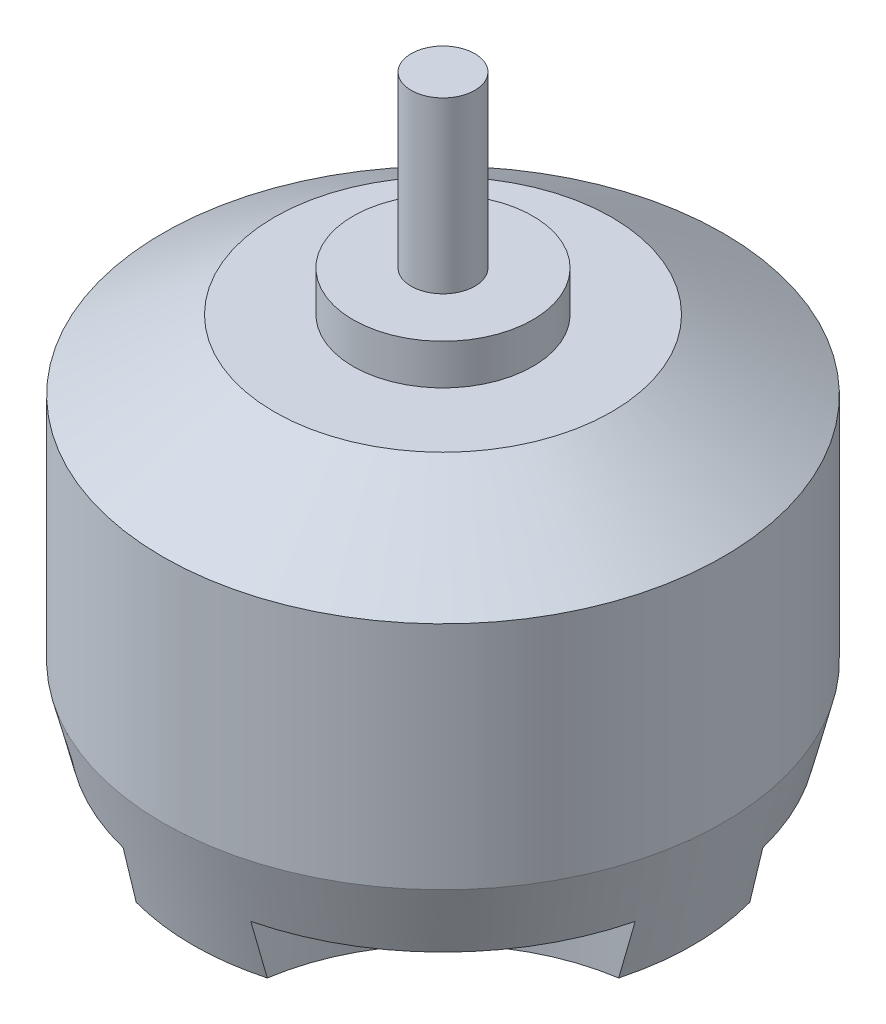
ISO-10303-21;
HEADER;
FILE_DESCRIPTION(('STEP AP214'),'2;1');
FILE_NAME('part.step','',(''),(''),'','','');
FILE_SCHEMA(('AUTOMOTIVE_DESIGN { 1 0 10303 214 1 1 1 1 }'));
ENDSEC;
DATA;
#1=APPLICATION_CONTEXT('core data for automotive mechanical design processes');
#2=APPLICATION_PROTOCOL_DEFINITION('international standard','automotive_design',2000,#1);
#3=PRODUCT_CONTEXT('',#1,'mechanical');
#4=PRODUCT('Part','Part','',(#3));
#5=PRODUCT_RELATED_PRODUCT_CATEGORY('part','',(#4));
#6=PRODUCT_DEFINITION_FORMATION('','',#4);
#7=PRODUCT_DEFINITION_CONTEXT('part definition',#1,'design');
#8=PRODUCT_DEFINITION('design','',#6,#7);
#9=PRODUCT_DEFINITION_SHAPE('','',#8);
#10=(LENGTH_UNIT() NAMED_UNIT(*) SI_UNIT(.MILLI.,.METRE.));
#11=(NAMED_UNIT(*) PLANE_ANGLE_UNIT() SI_UNIT($,.RADIAN.));
#12=(NAMED_UNIT(*) SI_UNIT($,.STERADIAN.) SOLID_ANGLE_UNIT());
#13=UNCERTAINTY_MEASURE_WITH_UNIT(LENGTH_MEASURE(1.E-05),#10,'distance_accuracy_value','');
#14=(GEOMETRIC_REPRESENTATION_CONTEXT(3) GLOBAL_UNCERTAINTY_ASSIGNED_CONTEXT((#13)) GLOBAL_UNIT_ASSIGNED_CONTEXT((#10,
#11,#12)) REPRESENTATION_CONTEXT('',''));
#15=CARTESIAN_POINT('',(0.,0.,0.));
#16=DIRECTION('',(0.,0.,1.));
#17=DIRECTION('',(1.,0.,0.));
#18=AXIS2_PLACEMENT_3D('',#15,#16,#17);
#19=CARTESIAN_POINT('',(0.,0.,0.));
#20=DIRECTION('',(0.,1.,0.));
#21=DIRECTION('',(0.,0.,1.));
#22=AXIS2_PLACEMENT_3D('',#19,#20,#21);
#23=PLANE('',#22);
#24=CARTESIAN_POINT('',(0.,0.,-9.45));
#25=DIRECTION('',(0.,-1.,0.));
#26=DIRECTION('',(0.,0.,-1.));
#27=AXIS2_PLACEMENT_3D('',#24,#25,#26);
#28=CIRCLE('',#27,1.2);
#29=CARTESIAN_POINT('',(0.,0.,-10.65));
#30=VERTEX_POINT('',#29);
#31=EDGE_CURVE('E255',#30,#30,#28,.T.);
#32=ORIENTED_EDGE('',*,*,#31,.F.);
#33=EDGE_LOOP('',(#32));
#34=FACE_BOUND('',#33,.T.);
#35=CARTESIAN_POINT('',(0.,0.,9.45));
#36=DIRECTION('',(0.,-1.,0.));
#37=DIRECTION('',(0.,0.,-1.));
#38=AXIS2_PLACEMENT_3D('',#35,#36,#37);
#39=CIRCLE('',#38,1.2);
#40=CARTESIAN_POINT('',(0.,0.,8.25));
#41=VERTEX_POINT('',#40);
#42=EDGE_CURVE('E259',#41,#41,#39,.T.);
#43=ORIENTED_EDGE('',*,*,#42,.F.);
#44=EDGE_LOOP('',(#43));
#45=FACE_BOUND('',#44,.T.);
#46=CARTESIAN_POINT('',(7.95,0.,0.));
#47=DIRECTION('',(0.,-1.,0.));
#48=DIRECTION('',(0.,0.,-1.));
#49=AXIS2_PLACEMENT_3D('',#46,#47,#48);
#50=CIRCLE('',#49,1.2);
#51=CARTESIAN_POINT('',(7.95,0.,-1.2));
#52=VERTEX_POINT('',#51);
#53=EDGE_CURVE('E263',#52,#52,#50,.T.);
#54=ORIENTED_EDGE('',*,*,#53,.F.);
#55=EDGE_LOOP('',(#54));
#56=FACE_BOUND('',#55,.T.);
#57=CARTESIAN_POINT('',(-7.95,0.,0.));
#58=DIRECTION('',(0.,-1.,0.));
#59=DIRECTION('',(0.,0.,-1.));
#60=AXIS2_PLACEMENT_3D('',#57,#58,#59);
#61=CIRCLE('',#60,1.2);
#62=CARTESIAN_POINT('',(-7.95,0.,-1.2));
#63=VERTEX_POINT('',#62);
#64=EDGE_CURVE('E266',#63,#63,#61,.T.);
#65=ORIENTED_EDGE('',*,*,#64,.F.);
#66=EDGE_LOOP('',(#65));
#67=FACE_BOUND('',#66,.T.);
#68=CARTESIAN_POINT('',(-13.5185058345957,0.,13.5185058345959));
#69=DIRECTION('',(0.,-1.,0.));
#70=DIRECTION('',(0.,0.,-1.));
#71=AXIS2_PLACEMENT_3D('',#68,#69,#70);
#72=CIRCLE('',#71,10.3935058345959);
#73=CARTESIAN_POINT('',(-11.9418930702989,0.,3.24527578143173));
#74=VERTEX_POINT('',#73);
#75=CARTESIAN_POINT('',(-3.24527578143153,0.,11.9418930702989));
#76=VERTEX_POINT('',#75);
#77=EDGE_CURVE('E113',#74,#76,#72,.T.);
#78=ORIENTED_EDGE('',*,*,#77,.F.);
#79=CARTESIAN_POINT('',(0.,0.,0.));
#80=DIRECTION('',(0.,1.,0.));
#81=DIRECTION('',(0.,0.,1.));
#82=AXIS2_PLACEMENT_3D('',#79,#80,#81);
#83=CIRCLE('',#82,12.375);
#84=CARTESIAN_POINT('',(-11.9418930702988,0.,-3.2452757814319));
#85=VERTEX_POINT('',#84);
#86=EDGE_CURVE('E101',#85,#74,#83,.T.);
#87=ORIENTED_EDGE('',*,*,#86,.F.);
#88=CARTESIAN_POINT('',(-13.5185058345956,0.,-13.5185058345958));
#89=DIRECTION('',(0.,-1.,0.));
#90=DIRECTION('',(0.,0.,-1.));
#91=AXIS2_PLACEMENT_3D('',#88,#89,#90);
#92=CIRCLE('',#91,10.3935058345956);
#93=CARTESIAN_POINT('',(-3.2452757814317,0.,-11.9418930702989));
#94=VERTEX_POINT('',#93);
#95=EDGE_CURVE('E145',#94,#85,#92,.T.);
#96=ORIENTED_EDGE('',*,*,#95,.F.);
#97=CARTESIAN_POINT('',(3.24527578143193,0.,-11.9418930702988));
#98=VERTEX_POINT('',#97);
#99=EDGE_CURVE('E169',#98,#94,#83,.T.);
#100=ORIENTED_EDGE('',*,*,#99,.F.);
#101=CARTESIAN_POINT('',(13.518505834596,0.,-13.5185058345956));
#102=DIRECTION('',(0.,-1.,0.));
#103=DIRECTION('',(0.,0.,-1.));
#104=AXIS2_PLACEMENT_3D('',#101,#102,#103);
#105=CIRCLE('',#104,10.3935058345958);
#106=CARTESIAN_POINT('',(11.9418930702989,0.,-3.24527578143153));
#107=VERTEX_POINT('',#106);
#108=EDGE_CURVE('E124',#107,#98,#105,.T.);
#109=ORIENTED_EDGE('',*,*,#108,.F.);
#110=CARTESIAN_POINT('',(11.9418930702989,0.,3.24527578143168));
#111=VERTEX_POINT('',#110);
#112=EDGE_CURVE('E104',#111,#107,#83,.T.);
#113=ORIENTED_EDGE('',*,*,#112,.F.);
#114=CARTESIAN_POINT('',(13.5185058345959,0.,13.5185058345956));
#115=DIRECTION('',(0.,-1.,0.));
#116=DIRECTION('',(0.,0.,-1.));
#117=AXIS2_PLACEMENT_3D('',#114,#115,#116);
#118=CIRCLE('',#117,10.3935058345957);
#119=CARTESIAN_POINT('',(3.24527578143197,0.,11.9418930702988));
#120=VERTEX_POINT('',#119);
#121=EDGE_CURVE('E110',#120,#111,#118,.T.);
#122=ORIENTED_EDGE('',*,*,#121,.F.);
#123=EDGE_CURVE('E93',#76,#120,#83,.T.);
#124=ORIENTED_EDGE('',*,*,#123,.F.);
#125=EDGE_LOOP('',(#78,#87,#96,#100,#109,#113,#122,#124));
#126=FACE_BOUND('',#125,.T.);
#127=CARTESIAN_POINT('',(0.,0.,0.));
#128=DIRECTION('',(0.,1.,0.));
#129=DIRECTION('',(0.,0.,1.));
#130=AXIS2_PLACEMENT_3D('',#127,#128,#129);
#131=CIRCLE('',#130,1.575);
#132=CARTESIAN_POINT('',(0.,0.,1.575));
#133=VERTEX_POINT('',#132);
#134=EDGE_CURVE('E11',#133,#133,#131,.F.);
#135=ORIENTED_EDGE('',*,*,#134,.F.);
#136=EDGE_LOOP('',(#135));
#137=FACE_BOUND('',#136,.T.);
#138=ADVANCED_FACE('F31',(#34,#45,#56,#67,#126,#137),#23,.F.);
#139=CARTESIAN_POINT('',(0.,22.85,0.));
#140=DIRECTION('',(0.,1.,0.));
#141=DIRECTION('',(0.,0.,1.));
#142=AXIS2_PLACEMENT_3D('',#139,#140,#141);
#143=PLANE('',#142);
#144=CARTESIAN_POINT('',(0.,22.85,0.));
#145=DIRECTION('',(0.,1.,0.));
#146=DIRECTION('',(0.,0.,1.));
#147=AXIS2_PLACEMENT_3D('',#144,#145,#146);
#148=CIRCLE('',#147,4.45);
#149=CARTESIAN_POINT('',(0.,22.85,4.45));
#150=VERTEX_POINT('',#149);
#151=EDGE_CURVE('E128',#150,#150,#148,.T.);
#152=ORIENTED_EDGE('',*,*,#151,.T.);
#153=EDGE_LOOP('',(#152));
#154=FACE_BOUND('',#153,.T.);
#155=CARTESIAN_POINT('',(0.,22.85,0.));
#156=DIRECTION('',(0.,1.,0.));
#157=DIRECTION('',(0.,0.,1.));
#158=AXIS2_PLACEMENT_3D('',#155,#156,#157);
#159=CIRCLE('',#158,1.575);
#160=CARTESIAN_POINT('',(0.,22.85,1.575));
#161=VERTEX_POINT('',#160);
#162=EDGE_CURVE('E280',#161,#161,#159,.T.);
#163=ORIENTED_EDGE('',*,*,#162,.F.);
#164=EDGE_LOOP('',(#163));
#165=FACE_BOUND('',#164,.T.);
#166=ADVANCED_FACE('F233',(#154,#165),#143,.T.);
#167=CARTESIAN_POINT('',(0.,20.85,0.));
#168=DIRECTION('',(0.,1.,0.));
#169=DIRECTION('',(0.,0.,1.));
#170=AXIS2_PLACEMENT_3D('',#167,#168,#169);
#171=PLANE('',#170);
#172=CARTESIAN_POINT('',(0.,20.85,0.));
#173=DIRECTION('',(0.,1.,0.));
#174=DIRECTION('',(0.,0.,1.));
#175=AXIS2_PLACEMENT_3D('',#172,#173,#174);
#176=CIRCLE('',#175,8.35);
#177=CARTESIAN_POINT('',(0.,20.85,8.35));
#178=VERTEX_POINT('',#177);
#179=EDGE_CURVE('E131',#178,#178,#176,.T.);
#180=ORIENTED_EDGE('',*,*,#179,.T.);
#181=EDGE_LOOP('',(#180));
#182=FACE_BOUND('',#181,.T.);
#183=CARTESIAN_POINT('',(0.,20.85,0.));
#184=DIRECTION('',(0.,1.,0.));
#185=DIRECTION('',(0.,0.,1.));
#186=AXIS2_PLACEMENT_3D('',#183,#184,#185);
#187=CIRCLE('',#186,4.45);
#188=CARTESIAN_POINT('',(0.,20.85,4.45));
#189=VERTEX_POINT('',#188);
#190=EDGE_CURVE('E121',#189,#189,#187,.T.);
#191=ORIENTED_EDGE('',*,*,#190,.F.);
#192=EDGE_LOOP('',(#191));
#193=FACE_BOUND('',#192,.T.);
#194=ADVANCED_FACE('F237',(#182,#193),#171,.T.);
#195=CARTESIAN_POINT('',(0.,20.85,0.));
#196=DIRECTION('',(0.,-1.,0.));
#197=DIRECTION('',(0.,0.,-1.));
#198=AXIS2_PLACEMENT_3D('',#195,#196,#197);
#199=CYLINDRICAL_SURFACE('',#198,13.875);
#200=CARTESIAN_POINT('',(0.,6.,0.));
#201=DIRECTION('',(0.,1.,0.));
#202=DIRECTION('',(0.,0.,1.));
#203=AXIS2_PLACEMENT_3D('',#200,#201,#202);
#204=CIRCLE('',#203,13.875);
#205=CARTESIAN_POINT('',(0.,6.,13.875));
#206=VERTEX_POINT('',#205);
#207=EDGE_CURVE('E102',#206,#206,#204,.T.);
#208=ORIENTED_EDGE('',*,*,#207,.T.);
#209=EDGE_LOOP('',(#208));
#210=FACE_BOUND('',#209,.T.);
#211=CARTESIAN_POINT('',(0.,17.4,0.));
#212=DIRECTION('',(0.,1.,0.));
#213=DIRECTION('',(0.,0.,1.));
#214=AXIS2_PLACEMENT_3D('',#211,#212,#213);
#215=CIRCLE('',#214,13.875);
#216=CARTESIAN_POINT('',(0.,17.4,13.875));
#217=VERTEX_POINT('',#216);
#218=EDGE_CURVE('E136',#217,#217,#215,.T.);
#219=ORIENTED_EDGE('',*,*,#218,.F.);
#220=EDGE_LOOP('',(#219));
#221=FACE_BOUND('',#220,.T.);
#222=ADVANCED_FACE('F33',(#210,#221),#199,.T.);
#223=CARTESIAN_POINT('',(0.,20.85,0.));
#224=DIRECTION('',(0.,-1.,0.));
#225=DIRECTION('',(0.,0.,-1.));
#226=AXIS2_PLACEMENT_3D('',#223,#224,#225);
#227=CONICAL_SURFACE('',#226,8.35,1.01260384625395);
#228=ORIENTED_EDGE('',*,*,#218,.T.);
#229=EDGE_LOOP('',(#228));
#230=FACE_BOUND('',#229,.T.);
#231=ORIENTED_EDGE('',*,*,#179,.F.);
#232=EDGE_LOOP('',(#231));
#233=FACE_BOUND('',#232,.T.);
#234=ADVANCED_FACE('F241',(#230,#233),#227,.T.);
#235=CARTESIAN_POINT('',(0.,22.85,0.));
#236=DIRECTION('',(0.,-1.,0.));
#237=DIRECTION('',(0.,0.,-1.));
#238=AXIS2_PLACEMENT_3D('',#235,#236,#237);
#239=CYLINDRICAL_SURFACE('',#238,4.45);
#240=ORIENTED_EDGE('',*,*,#151,.F.);
#241=EDGE_LOOP('',(#240));
#242=FACE_BOUND('',#241,.T.);
#243=ORIENTED_EDGE('',*,*,#190,.T.);
#244=EDGE_LOOP('',(#243));
#245=FACE_BOUND('',#244,.T.);
#246=ADVANCED_FACE('F191',(#242,#245),#239,.T.);
#247=CARTESIAN_POINT('',(0.,0.,0.));
#248=DIRECTION('',(0.,1.,0.));
#249=DIRECTION('',(0.,0.,1.));
#250=AXIS2_PLACEMENT_3D('',#247,#248,#249);
#251=CONICAL_SURFACE('',#250,12.375,0.244978663126864);
#252=ORIENTED_EDGE('',*,*,#207,.F.);
#253=EDGE_LOOP('',(#252));
#254=FACE_BOUND('',#253,.T.);
#255=CARTESIAN_POINT('',(0.,2.75,0.));
#256=DIRECTION('',(0.,1.,0.));
#257=DIRECTION('',(0.,0.,1.));
#258=AXIS2_PLACEMENT_3D('',#255,#256,#257);
#259=CIRCLE('',#258,13.0625);
#260=CARTESIAN_POINT('',(12.6746859728675,2.75,3.15931032651066));
#261=VERTEX_POINT('',#260);
#262=CARTESIAN_POINT('',(3.15931032651097,2.75,12.6746859728674));
#263=VERTEX_POINT('',#262);
#264=EDGE_CURVE('E227',#261,#263,#259,.F.);
#265=ORIENTED_EDGE('',*,*,#264,.F.);
#266=CARTESIAN_POINT('',(11.9418390018789,-0.000199999999999917,3.24528407935324));
#267=CARTESIAN_POINT('',(12.0037212327462,0.228706262194263,3.23578747578466));
#268=CARTESIAN_POINT('',(12.0653812901875,0.457697426974031,3.22689592361602));
#269=CARTESIAN_POINT('',(12.1882869948299,0.915827175325055,3.21028919892953));
#270=CARTESIAN_POINT('',(12.2495326528453,1.14496575487712,3.20257399559938));
#271=CARTESIAN_POINT('',(12.3716427042354,1.60337982893091,3.18828575493628));
#272=CARTESIAN_POINT('',(12.4325070977977,1.8326553233652,3.18171271704124));
#273=CARTESIAN_POINT('',(12.5538821094731,2.29133561510875,3.16968071959632));
#274=CARTESIAN_POINT('',(12.6143927182766,2.52074041564801,3.16422178923647));
#275=CARTESIAN_POINT('',(12.6747385706372,2.7502,3.15930604223488));
#276=B_SPLINE_CURVE_WITH_KNOTS('',3,(#266,#267,#268,#269,#270,#271,#272,#273,#274,#275),
.UNSPECIFIED.,.F.,.F.,(4,2,2,2,4),(0.,0.711939090465559,1.42385952978865,2.13577961875649,
2.84771835789679),.UNSPECIFIED.);
#277=EDGE_CURVE('E114',#111,#261,#276,.T.);
#278=ORIENTED_EDGE('',*,*,#277,.F.);
#279=ORIENTED_EDGE('',*,*,#112,.T.);
#280=CARTESIAN_POINT('',(12.6747385706372,2.7502,-3.15930604223473));
#281=CARTESIAN_POINT('',(12.6143927182766,2.52074041564801,-3.16422178923631));
#282=CARTESIAN_POINT('',(12.5538821094731,2.29133561510875,-3.16968071959617));
#283=CARTESIAN_POINT('',(12.4325070977977,1.8326553233652,-3.18171271704109));
#284=CARTESIAN_POINT('',(12.3716427042354,1.60337982893091,-3.18828575493613));
#285=CARTESIAN_POINT('',(12.2495326528453,1.14496575487712,-3.20257399559923));
#286=CARTESIAN_POINT('',(12.1882869948299,0.915827175325055,-3.21028919892938));
#287=CARTESIAN_POINT('',(12.0653812901875,0.457697426974031,-3.22689592361587));
#288=CARTESIAN_POINT('',(12.0037212327463,0.228706262194264,-3.23578747578451));
#289=CARTESIAN_POINT('',(11.941839001879,-0.000199999999999326,-3.24528407935309));
#290=B_SPLINE_CURVE_WITH_KNOTS('',3,(#280,#281,#282,#283,#284,#285,#286,#287,#288,#289),
.UNSPECIFIED.,.F.,.F.,(4,2,2,2,4),(0.,0.711938739140294,1.42385882810813,2.13577926743123,
2.84771835789679),.UNSPECIFIED.);
#291=CARTESIAN_POINT('',(12.6746859728675,2.75,-3.1593103265105));
#292=VERTEX_POINT('',#291);
#293=EDGE_CURVE('E166',#292,#107,#290,.T.);
#294=ORIENTED_EDGE('',*,*,#293,.F.);
#295=CARTESIAN_POINT('',(0.,2.75,0.));
#296=DIRECTION('',(0.,-1.,0.));
#297=DIRECTION('',(0.,0.,-1.));
#298=AXIS2_PLACEMENT_3D('',#295,#296,#297);
#299=CIRCLE('',#298,13.0625);
#300=CARTESIAN_POINT('',(3.15931032651093,2.75,-12.6746859728674));
#301=VERTEX_POINT('',#300);
#302=EDGE_CURVE('E530',#292,#301,#299,.F.);
#303=ORIENTED_EDGE('',*,*,#302,.T.);
#304=CARTESIAN_POINT('',(3.2452840793535,-0.000199999999999917,-11.9418390018788));
#305=CARTESIAN_POINT('',(3.23578747578491,0.228706262194263,-12.0037212327462));
#306=CARTESIAN_POINT('',(3.22689592361628,0.45769742697403,-12.0653812901874));
#307=CARTESIAN_POINT('',(3.21028919892979,0.915827175325054,-12.1882869948298));
#308=CARTESIAN_POINT('',(3.20257399559964,1.14496575487712,-12.2495326528452));
#309=CARTESIAN_POINT('',(3.18828575493654,1.60337982893091,-12.3716427042353));
#310=CARTESIAN_POINT('',(3.18171271704151,1.8326553233652,-12.4325070977976));
#311=CARTESIAN_POINT('',(3.16968071959659,2.29133561510875,-12.553882109473));
#312=CARTESIAN_POINT('',(3.16422178923674,2.52074041564801,-12.6143927182765));
#313=CARTESIAN_POINT('',(3.15930604223516,2.7502,-12.6747385706371));
#314=B_SPLINE_CURVE_WITH_KNOTS('',3,(#304,#305,#306,#307,#308,#309,#310,#311,#312,#313),
.UNSPECIFIED.,.F.,.F.,(4,2,2,2,4),(0.,0.711939090465558,1.42385952978865,2.13577961875649,
2.84771835789678),.UNSPECIFIED.);
#315=EDGE_CURVE('E165',#98,#301,#314,.T.);
#316=ORIENTED_EDGE('',*,*,#315,.F.);
#317=ORIENTED_EDGE('',*,*,#99,.T.);
#318=CARTESIAN_POINT('',(-3.15930604223492,2.7502,-12.6747385706372));
#319=CARTESIAN_POINT('',(-3.1642217892365,2.52074041564801,-12.6143927182766));
#320=CARTESIAN_POINT('',(-3.16968071959636,2.29133561510875,-12.5538821094731));
#321=CARTESIAN_POINT('',(-3.18171271704127,1.8326553233652,-12.4325070977977));
#322=CARTESIAN_POINT('',(-3.18828575493631,1.60337982893091,-12.3716427042354));
#323=CARTESIAN_POINT('',(-3.20257399559941,1.14496575487712,-12.2495326528453));
#324=CARTESIAN_POINT('',(-3.21028919892956,0.915827175325055,-12.1882869948299));
#325=CARTESIAN_POINT('',(-3.22689592361605,0.457697426974032,-12.0653812901875));
#326=CARTESIAN_POINT('',(-3.23578747578469,0.228706262194264,-12.0037212327462));
#327=CARTESIAN_POINT('',(-3.24528407935327,-0.000199999999999032,-11.9418390018789));
#328=B_SPLINE_CURVE_WITH_KNOTS('',3,(#318,#319,#320,#321,#322,#323,#324,#325,#326,#327),
.UNSPECIFIED.,.F.,.F.,(4,2,2,2,4),(0.,0.711938739140295,1.42385882810813,2.13577926743123,
2.84771835789678),.UNSPECIFIED.);
#329=CARTESIAN_POINT('',(-3.15931032651069,2.75,-12.6746859728674));
#330=VERTEX_POINT('',#329);
#331=EDGE_CURVE('E208',#330,#94,#328,.T.);
#332=ORIENTED_EDGE('',*,*,#331,.F.);
#333=CARTESIAN_POINT('',(0.,2.75,0.));
#334=DIRECTION('',(0.,-1.,0.));
#335=DIRECTION('',(0.,0.,-1.));
#336=AXIS2_PLACEMENT_3D('',#333,#334,#335);
#337=CIRCLE('',#336,13.0625);
#338=CARTESIAN_POINT('',(-12.6746859728674,2.75,-3.15931032651091));
#339=VERTEX_POINT('',#338);
#340=EDGE_CURVE('E533',#330,#339,#337,.F.);
#341=ORIENTED_EDGE('',*,*,#340,.T.);
#342=CARTESIAN_POINT('',(-11.9418390018789,-0.0002000000000004,-3.24528407935347));
#343=CARTESIAN_POINT('',(-12.0037212327462,0.228706262194263,-3.23578747578489));
#344=CARTESIAN_POINT('',(-12.0653812901874,0.45769742697403,-3.22689592361625));
#345=CARTESIAN_POINT('',(-12.1882869948298,0.915827175325054,-3.21028919892977));
#346=CARTESIAN_POINT('',(-12.2495326528452,1.14496575487712,-3.20257399559961));
#347=CARTESIAN_POINT('',(-12.3716427042353,1.60337982893091,-3.18828575493652));
#348=CARTESIAN_POINT('',(-12.4325070977976,1.8326553233652,-3.18171271704148));
#349=CARTESIAN_POINT('',(-12.553882109473,2.29133561510875,-3.16968071959657));
#350=CARTESIAN_POINT('',(-12.6143927182765,2.52074041564801,-3.16422178923672));
#351=CARTESIAN_POINT('',(-12.6747385706371,2.7502,-3.15930604223513));
#352=B_SPLINE_CURVE_WITH_KNOTS('',3,(#342,#343,#344,#345,#346,#347,#348,#349,#350,#351),
.UNSPECIFIED.,.F.,.F.,(4,2,2,2,4),(0.,0.711939090465558,1.42385952978865,2.13577961875649,
2.84771835789679),.UNSPECIFIED.);
#353=EDGE_CURVE('E201',#85,#339,#352,.T.);
#354=ORIENTED_EDGE('',*,*,#353,.F.);
#355=ORIENTED_EDGE('',*,*,#86,.T.);
#356=CARTESIAN_POINT('',(-12.6747385706372,2.7502,3.15930604223496));
#357=CARTESIAN_POINT('',(-12.6143927182765,2.52074041564801,3.16422178923654));
#358=CARTESIAN_POINT('',(-12.5538821094731,2.29133561510875,3.1696807195964));
#359=CARTESIAN_POINT('',(-12.4325070977977,1.8326553233652,3.18171271704131));
#360=CARTESIAN_POINT('',(-12.3716427042354,1.60337982893091,3.18828575493635));
#361=CARTESIAN_POINT('',(-12.2495326528453,1.14496575487712,3.20257399559945));
#362=CARTESIAN_POINT('',(-12.1882869948298,0.915827175325054,3.2102891989296));
#363=CARTESIAN_POINT('',(-12.0653812901875,0.457697426974031,3.22689592361609));
#364=CARTESIAN_POINT('',(-12.0037212327462,0.228706262194264,3.23578747578472));
#365=CARTESIAN_POINT('',(-11.9418390018789,-0.000199999999999568,3.2452840793533));
#366=B_SPLINE_CURVE_WITH_KNOTS('',3,(#356,#357,#358,#359,#360,#361,#362,#363,#364,#365),
.UNSPECIFIED.,.F.,.F.,(4,2,2,2,4),(0.,0.711938739140295,1.42385882810813,2.13577926743123,
2.84771835789678),.UNSPECIFIED.);
#367=CARTESIAN_POINT('',(-12.6746859728674,2.75,3.15931032651074));
#368=VERTEX_POINT('',#367);
#369=EDGE_CURVE('E46',#368,#74,#366,.T.);
#370=ORIENTED_EDGE('',*,*,#369,.F.);
#371=CARTESIAN_POINT('',(0.,2.75,0.));
#372=DIRECTION('',(0.,1.,0.));
#373=DIRECTION('',(0.,0.,1.));
#374=AXIS2_PLACEMENT_3D('',#371,#372,#373);
#375=CIRCLE('',#374,13.0625);
#376=CARTESIAN_POINT('',(-3.15931032651051,2.75,12.6746859728675));
#377=VERTEX_POINT('',#376);
#378=EDGE_CURVE('E39',#377,#368,#375,.F.);
#379=ORIENTED_EDGE('',*,*,#378,.F.);
#380=CARTESIAN_POINT('',(-3.24528407935309,-0.000199999999999917,11.941839001879));
#381=CARTESIAN_POINT('',(-3.23578747578451,0.228706262194263,12.0037212327463));
#382=CARTESIAN_POINT('',(-3.22689592361587,0.45769742697403,12.0653812901875));
#383=CARTESIAN_POINT('',(-3.21028919892938,0.915827175325054,12.1882869948299));
#384=CARTESIAN_POINT('',(-3.20257399559923,1.14496575487712,12.2495326528453));
#385=CARTESIAN_POINT('',(-3.18828575493613,1.60337982893091,12.3716427042354));
#386=CARTESIAN_POINT('',(-3.1817127170411,1.8326553233652,12.4325070977977));
#387=CARTESIAN_POINT('',(-3.16968071959618,2.29133561510875,12.5538821094731));
#388=CARTESIAN_POINT('',(-3.16422178923632,2.52074041564801,12.6143927182766));
#389=CARTESIAN_POINT('',(-3.15930604223474,2.7502,12.6747385706372));
#390=B_SPLINE_CURVE_WITH_KNOTS('',3,(#380,#381,#382,#383,#384,#385,#386,#387,#388,#389),
.UNSPECIFIED.,.F.,.F.,(4,2,2,2,4),(0.,0.711939090465558,1.42385952978865,2.13577961875649,
2.84771835789678),.UNSPECIFIED.);
#391=EDGE_CURVE('E96',#76,#377,#390,.T.);
#392=ORIENTED_EDGE('',*,*,#391,.F.);
#393=ORIENTED_EDGE('',*,*,#123,.T.);
#394=CARTESIAN_POINT('',(3.15930604223519,2.7502,12.6747385706371));
#395=CARTESIAN_POINT('',(3.16422178923678,2.52074041564801,12.6143927182765));
#396=CARTESIAN_POINT('',(3.16968071959663,2.29133561510875,12.553882109473));
#397=CARTESIAN_POINT('',(3.18171271704155,1.8326553233652,12.4325070977976));
#398=CARTESIAN_POINT('',(3.18828575493658,1.60337982893091,12.3716427042353));
#399=CARTESIAN_POINT('',(3.20257399559968,1.14496575487712,12.2495326528452));
#400=CARTESIAN_POINT('',(3.21028919892983,0.915827175325054,12.1882869948298));
#401=CARTESIAN_POINT('',(3.22689592361632,0.457697426974031,12.0653812901874));
#402=CARTESIAN_POINT('',(3.23578747578496,0.228706262194264,12.0037212327462));
#403=CARTESIAN_POINT('',(3.24528407935354,-0.000199999999999649,11.9418390018788));
#404=B_SPLINE_CURVE_WITH_KNOTS('',3,(#394,#395,#396,#397,#398,#399,#400,#401,#402,#403),
.UNSPECIFIED.,.F.,.F.,(4,2,2,2,4),(0.,0.711938739140295,1.42385882810813,2.13577926743123,
2.84771835789679),.UNSPECIFIED.);
#405=EDGE_CURVE('E53',#263,#120,#404,.T.);
#406=ORIENTED_EDGE('',*,*,#405,.F.);
#407=EDGE_LOOP('',(#265,#278,#279,#294,#303,#316,#317,#332,#341,#354,#355,#370,#379,#392,#393,#406));
#408=FACE_BOUND('',#407,.T.);
#409=ADVANCED_FACE('F94',(#254,#408),#251,.T.);
#410=CARTESIAN_POINT('',(6.75925291729807,2.75,6.75925291729791));
#411=DIRECTION('',(0.,1.,0.));
#412=DIRECTION('',(0.,0.,1.));
#413=AXIS2_PLACEMENT_3D('',#410,#411,#412);
#414=PLANE('',#413);
#415=CARTESIAN_POINT('',(13.5185058345959,2.75,13.5185058345956));
#416=DIRECTION('',(0.,-1.,0.));
#417=DIRECTION('',(0.,0.,-1.));
#418=AXIS2_PLACEMENT_3D('',#415,#416,#417);
#419=CIRCLE('',#418,10.3935058345957);
#420=EDGE_CURVE('E112',#263,#261,#419,.T.);
#421=ORIENTED_EDGE('',*,*,#420,.T.);
#422=ORIENTED_EDGE('',*,*,#264,.T.);
#423=EDGE_LOOP('',(#421,#422));
#424=FACE_BOUND('',#423,.T.);
#425=ADVANCED_FACE('F190',(#424),#414,.F.);
#426=CARTESIAN_POINT('',(13.5185058345959,2.75,13.5185058345956));
#427=DIRECTION('',(0.,-1.,0.));
#428=DIRECTION('',(0.,0.,-1.));
#429=AXIS2_PLACEMENT_3D('',#426,#427,#428);
#430=CYLINDRICAL_SURFACE('',#429,10.3935058345957);
#431=ORIENTED_EDGE('',*,*,#420,.F.);
#432=ORIENTED_EDGE('',*,*,#405,.T.);
#433=ORIENTED_EDGE('',*,*,#121,.T.);
#434=ORIENTED_EDGE('',*,*,#277,.T.);
#435=EDGE_LOOP('',(#431,#432,#433,#434));
#436=FACE_BOUND('',#435,.T.);
#437=ADVANCED_FACE('F108',(#436),#430,.F.);
#438=CARTESIAN_POINT('',(6.75925291729801,2.75,-6.75925291729778));
#439=DIRECTION('',(0.,-1.,0.));
#440=DIRECTION('',(0.,0.,-1.));
#441=AXIS2_PLACEMENT_3D('',#438,#439,#440);
#442=PLANE('',#441);
#443=ORIENTED_EDGE('',*,*,#302,.F.);
#444=CARTESIAN_POINT('',(13.518505834596,2.75,-13.5185058345956));
#445=DIRECTION('',(0.,-1.,0.));
#446=DIRECTION('',(0.,0.,-1.));
#447=AXIS2_PLACEMENT_3D('',#444,#445,#446);
#448=CIRCLE('',#447,10.3935058345958);
#449=EDGE_CURVE('E119',#292,#301,#448,.T.);
#450=ORIENTED_EDGE('',*,*,#449,.T.);
#451=EDGE_LOOP('',(#443,#450));
#452=FACE_BOUND('',#451,.T.);
#453=ADVANCED_FACE('F232',(#452),#442,.T.);
#454=CARTESIAN_POINT('',(13.518505834596,2.75,-13.5185058345956));
#455=DIRECTION('',(0.,-1.,0.));
#456=DIRECTION('',(0.,0.,-1.));
#457=AXIS2_PLACEMENT_3D('',#454,#455,#456);
#458=CYLINDRICAL_SURFACE('',#457,10.3935058345958);
#459=ORIENTED_EDGE('',*,*,#449,.F.);
#460=ORIENTED_EDGE('',*,*,#293,.T.);
#461=ORIENTED_EDGE('',*,*,#108,.T.);
#462=ORIENTED_EDGE('',*,*,#315,.T.);
#463=EDGE_LOOP('',(#459,#460,#461,#462));
#464=FACE_BOUND('',#463,.T.);
#465=ADVANCED_FACE('F164',(#464),#458,.F.);
#466=CARTESIAN_POINT('',(-6.75925291729799,2.75,-6.75925291729846));
#467=DIRECTION('',(0.,-1.,0.));
#468=DIRECTION('',(0.,0.,-1.));
#469=AXIS2_PLACEMENT_3D('',#466,#467,#468);
#470=PLANE('',#469);
#471=ORIENTED_EDGE('',*,*,#340,.F.);
#472=CARTESIAN_POINT('',(-13.5185058345956,2.75,-13.5185058345958));
#473=DIRECTION('',(0.,-1.,0.));
#474=DIRECTION('',(0.,0.,-1.));
#475=AXIS2_PLACEMENT_3D('',#472,#473,#474);
#476=CIRCLE('',#475,10.3935058345956);
#477=EDGE_CURVE('E148',#330,#339,#476,.T.);
#478=ORIENTED_EDGE('',*,*,#477,.T.);
#479=EDGE_LOOP('',(#471,#478));
#480=FACE_BOUND('',#479,.T.);
#481=ADVANCED_FACE('F304',(#480),#470,.T.);
#482=CARTESIAN_POINT('',(-13.5185058345956,2.75,-13.5185058345958));
#483=DIRECTION('',(0.,-1.,0.));
#484=DIRECTION('',(0.,0.,-1.));
#485=AXIS2_PLACEMENT_3D('',#482,#483,#484);
#486=CYLINDRICAL_SURFACE('',#485,10.3935058345956);
#487=ORIENTED_EDGE('',*,*,#477,.F.);
#488=ORIENTED_EDGE('',*,*,#331,.T.);
#489=ORIENTED_EDGE('',*,*,#95,.T.);
#490=ORIENTED_EDGE('',*,*,#353,.T.);
#491=EDGE_LOOP('',(#487,#488,#489,#490));
#492=FACE_BOUND('',#491,.T.);
#493=ADVANCED_FACE('F300',(#492),#486,.F.);
#494=CARTESIAN_POINT('',(-6.7592529172981,2.75,6.75925291729859));
#495=DIRECTION('',(0.,1.,0.));
#496=DIRECTION('',(0.,0.,1.));
#497=AXIS2_PLACEMENT_3D('',#494,#495,#496);
#498=PLANE('',#497);
#499=CARTESIAN_POINT('',(-13.5185058345957,2.75,13.5185058345959));
#500=DIRECTION('',(0.,-1.,0.));
#501=DIRECTION('',(0.,0.,-1.));
#502=AXIS2_PLACEMENT_3D('',#499,#500,#501);
#503=CIRCLE('',#502,10.3935058345959);
#504=EDGE_CURVE('E142',#368,#377,#503,.T.);
#505=ORIENTED_EDGE('',*,*,#504,.T.);
#506=ORIENTED_EDGE('',*,*,#378,.T.);
#507=EDGE_LOOP('',(#505,#506));
#508=FACE_BOUND('',#507,.T.);
#509=ADVANCED_FACE('F141',(#508),#498,.F.);
#510=CARTESIAN_POINT('',(-13.5185058345957,2.75,13.5185058345959));
#511=DIRECTION('',(0.,-1.,0.));
#512=DIRECTION('',(0.,0.,-1.));
#513=AXIS2_PLACEMENT_3D('',#510,#511,#512);
#514=CYLINDRICAL_SURFACE('',#513,10.3935058345959);
#515=ORIENTED_EDGE('',*,*,#504,.F.);
#516=ORIENTED_EDGE('',*,*,#369,.T.);
#517=ORIENTED_EDGE('',*,*,#77,.T.);
#518=ORIENTED_EDGE('',*,*,#391,.T.);
#519=EDGE_LOOP('',(#515,#516,#517,#518));
#520=FACE_BOUND('',#519,.T.);
#521=ADVANCED_FACE('F144',(#520),#514,.F.);
#522=CARTESIAN_POINT('',(0.,31.25,0.));
#523=DIRECTION('',(0.,-1.,0.));
#524=DIRECTION('',(0.,0.,-1.));
#525=AXIS2_PLACEMENT_3D('',#522,#523,#524);
#526=CYLINDRICAL_SURFACE('',#525,1.575);
#527=CARTESIAN_POINT('',(0.,31.25,0.));
#528=DIRECTION('',(0.,1.,0.));
#529=DIRECTION('',(0.,0.,1.));
#530=AXIS2_PLACEMENT_3D('',#527,#528,#529);
#531=CIRCLE('',#530,1.575);
#532=CARTESIAN_POINT('',(0.,31.25,1.575));
#533=VERTEX_POINT('',#532);
#534=EDGE_CURVE('E281',#533,#533,#531,.T.);
#535=ORIENTED_EDGE('',*,*,#534,.F.);
#536=EDGE_LOOP('',(#535));
#537=FACE_BOUND('',#536,.T.);
#538=ORIENTED_EDGE('',*,*,#162,.T.);
#539=EDGE_LOOP('',(#538));
#540=FACE_BOUND('',#539,.T.);
#541=ADVANCED_FACE('F193',(#537,#540),#526,.T.);
#542=CARTESIAN_POINT('',(0.,31.25,0.));
#543=DIRECTION('',(0.,1.,0.));
#544=DIRECTION('',(0.,0.,1.));
#545=AXIS2_PLACEMENT_3D('',#542,#543,#544);
#546=PLANE('',#545);
#547=ORIENTED_EDGE('',*,*,#534,.T.);
#548=EDGE_LOOP('',(#547));
#549=FACE_BOUND('',#548,.T.);
#550=ADVANCED_FACE('F288',(#549),#546,.T.);
#551=CARTESIAN_POINT('',(0.,-1.4,0.));
#552=DIRECTION('',(0.,1.,0.));
#553=DIRECTION('',(0.,0.,1.));
#554=AXIS2_PLACEMENT_3D('',#551,#552,#553);
#555=CYLINDRICAL_SURFACE('',#554,1.575);
#556=CARTESIAN_POINT('',(0.,-1.4,0.));
#557=DIRECTION('',(0.,-1.,0.));
#558=DIRECTION('',(0.,0.,-1.));
#559=AXIS2_PLACEMENT_3D('',#556,#557,#558);
#560=CIRCLE('',#559,1.575);
#561=CARTESIAN_POINT('',(0.,-1.4,-1.575));
#562=VERTEX_POINT('',#561);
#563=EDGE_CURVE('E272',#562,#562,#560,.T.);
#564=ORIENTED_EDGE('',*,*,#563,.F.);
#565=EDGE_LOOP('',(#564));
#566=FACE_BOUND('',#565,.T.);
#567=ORIENTED_EDGE('',*,*,#134,.T.);
#568=EDGE_LOOP('',(#567));
#569=FACE_BOUND('',#568,.T.);
#570=ADVANCED_FACE('F294',(#566,#569),#555,.T.);
#571=CARTESIAN_POINT('',(0.,-1.4,0.));
#572=DIRECTION('',(0.,-1.,0.));
#573=DIRECTION('',(0.,0.,-1.));
#574=AXIS2_PLACEMENT_3D('',#571,#572,#573);
#575=PLANE('',#574);
#576=ORIENTED_EDGE('',*,*,#563,.T.);
#577=EDGE_LOOP('',(#576));
#578=FACE_BOUND('',#577,.T.);
#579=ADVANCED_FACE('F367',(#578),#575,.T.);
#580=CARTESIAN_POINT('',(-7.95,3.,0.));
#581=DIRECTION('',(0.,-1.,0.));
#582=DIRECTION('',(0.,0.,-1.));
#583=AXIS2_PLACEMENT_3D('',#580,#581,#582);
#584=CYLINDRICAL_SURFACE('',#583,1.2);
#585=CARTESIAN_POINT('',(-7.95,3.,0.));
#586=DIRECTION('',(0.,-1.,0.));
#587=DIRECTION('',(0.,0.,-1.));
#588=AXIS2_PLACEMENT_3D('',#585,#586,#587);
#589=CIRCLE('',#588,1.2);
#590=CARTESIAN_POINT('',(-7.95,3.,-1.2));
#591=VERTEX_POINT('',#590);
#592=EDGE_CURVE('E268',#591,#591,#589,.T.);
#593=ORIENTED_EDGE('',*,*,#592,.F.);
#594=EDGE_LOOP('',(#593));
#595=FACE_BOUND('',#594,.T.);
#596=ORIENTED_EDGE('',*,*,#64,.T.);
#597=EDGE_LOOP('',(#596));
#598=FACE_BOUND('',#597,.T.);
#599=ADVANCED_FACE('F376',(#595,#598),#584,.F.);
#600=CARTESIAN_POINT('',(-7.95,3.,0.));
#601=DIRECTION('',(0.,-1.,0.));
#602=DIRECTION('',(0.,0.,-1.));
#603=AXIS2_PLACEMENT_3D('',#600,#601,#602);
#604=PLANE('',#603);
#605=ORIENTED_EDGE('',*,*,#592,.T.);
#606=EDGE_LOOP('',(#605));
#607=FACE_BOUND('',#606,.T.);
#608=ADVANCED_FACE('F390',(#607),#604,.T.);
#609=CARTESIAN_POINT('',(7.95,3.,0.));
#610=DIRECTION('',(0.,-1.,0.));
#611=DIRECTION('',(0.,0.,-1.));
#612=AXIS2_PLACEMENT_3D('',#609,#610,#611);
#613=CYLINDRICAL_SURFACE('',#612,1.2);
#614=CARTESIAN_POINT('',(7.95,3.,0.));
#615=DIRECTION('',(0.,-1.,0.));
#616=DIRECTION('',(0.,0.,-1.));
#617=AXIS2_PLACEMENT_3D('',#614,#615,#616);
#618=CIRCLE('',#617,1.2);
#619=CARTESIAN_POINT('',(7.95,3.,-1.2));
#620=VERTEX_POINT('',#619);
#621=EDGE_CURVE('E269',#620,#620,#618,.T.);
#622=ORIENTED_EDGE('',*,*,#621,.F.);
#623=EDGE_LOOP('',(#622));
#624=FACE_BOUND('',#623,.T.);
#625=ORIENTED_EDGE('',*,*,#53,.T.);
#626=EDGE_LOOP('',(#625));
#627=FACE_BOUND('',#626,.T.);
#628=ADVANCED_FACE('F400',(#624,#627),#613,.F.);
#629=CARTESIAN_POINT('',(7.95,3.,0.));
#630=DIRECTION('',(0.,-1.,0.));
#631=DIRECTION('',(0.,0.,-1.));
#632=AXIS2_PLACEMENT_3D('',#629,#630,#631);
#633=PLANE('',#632);
#634=ORIENTED_EDGE('',*,*,#621,.T.);
#635=EDGE_LOOP('',(#634));
#636=FACE_BOUND('',#635,.T.);
#637=ADVANCED_FACE('F410',(#636),#633,.T.);
#638=CARTESIAN_POINT('',(0.,3.,9.45));
#639=DIRECTION('',(0.,-1.,0.));
#640=DIRECTION('',(0.,0.,-1.));
#641=AXIS2_PLACEMENT_3D('',#638,#639,#640);
#642=CYLINDRICAL_SURFACE('',#641,1.2);
#643=CARTESIAN_POINT('',(0.,3.,9.45));
#644=DIRECTION('',(0.,-1.,0.));
#645=DIRECTION('',(0.,0.,-1.));
#646=AXIS2_PLACEMENT_3D('',#643,#644,#645);
#647=CIRCLE('',#646,1.2);
#648=CARTESIAN_POINT('',(0.,3.,8.25));
#649=VERTEX_POINT('',#648);
#650=EDGE_CURVE('E468',#649,#649,#647,.T.);
#651=ORIENTED_EDGE('',*,*,#650,.F.);
#652=EDGE_LOOP('',(#651));
#653=FACE_BOUND('',#652,.T.);
#654=ORIENTED_EDGE('',*,*,#42,.T.);
#655=EDGE_LOOP('',(#654));
#656=FACE_BOUND('',#655,.T.);
#657=ADVANCED_FACE('F420',(#653,#656),#642,.F.);
#658=CARTESIAN_POINT('',(0.,3.,9.45));
#659=DIRECTION('',(0.,-1.,0.));
#660=DIRECTION('',(0.,0.,-1.));
#661=AXIS2_PLACEMENT_3D('',#658,#659,#660);
#662=PLANE('',#661);
#663=ORIENTED_EDGE('',*,*,#650,.T.);
#664=EDGE_LOOP('',(#663));
#665=FACE_BOUND('',#664,.T.);
#666=ADVANCED_FACE('F430',(#665),#662,.T.);
#667=CARTESIAN_POINT('',(0.,3.,-9.45));
#668=DIRECTION('',(0.,-1.,0.));
#669=DIRECTION('',(0.,0.,-1.));
#670=AXIS2_PLACEMENT_3D('',#667,#668,#669);
#671=CYLINDRICAL_SURFACE('',#670,1.2);
#672=CARTESIAN_POINT('',(0.,3.,-9.45));
#673=DIRECTION('',(0.,-1.,0.));
#674=DIRECTION('',(0.,0.,-1.));
#675=AXIS2_PLACEMENT_3D('',#672,#673,#674);
#676=CIRCLE('',#675,1.2);
#677=CARTESIAN_POINT('',(0.,3.,-10.65));
#678=VERTEX_POINT('',#677);
#679=EDGE_CURVE('E466',#678,#678,#676,.T.);
#680=ORIENTED_EDGE('',*,*,#679,.F.);
#681=EDGE_LOOP('',(#680));
#682=FACE_BOUND('',#681,.T.);
#683=ORIENTED_EDGE('',*,*,#31,.T.);
#684=EDGE_LOOP('',(#683));
#685=FACE_BOUND('',#684,.T.);
#686=ADVANCED_FACE('F440',(#682,#685),#671,.F.);
#687=CARTESIAN_POINT('',(0.,3.,-9.45));
#688=DIRECTION('',(0.,-1.,0.));
#689=DIRECTION('',(0.,0.,-1.));
#690=AXIS2_PLACEMENT_3D('',#687,#688,#689);
#691=PLANE('',#690);
#692=ORIENTED_EDGE('',*,*,#679,.T.);
#693=EDGE_LOOP('',(#692));
#694=FACE_BOUND('',#693,.T.);
#695=ADVANCED_FACE('F450',(#694),#691,.T.);
#696=CLOSED_SHELL('',(#138,#166,#194,#222,#234,#246,#409,#425,#437,#453,#465,#481,#493,#509,
#521,#541,#550,#570,#579,#599,#608,#628,#637,#657,#666,#686,#695));
#697=MANIFOLD_SOLID_BREP('B2',#696);
#698=ADVANCED_BREP_SHAPE_REPRESENTATION('',(#18,#697),#14);
#699=SHAPE_DEFINITION_REPRESENTATION(#9,#698);
ENDSEC;
END-ISO-10303-21;
